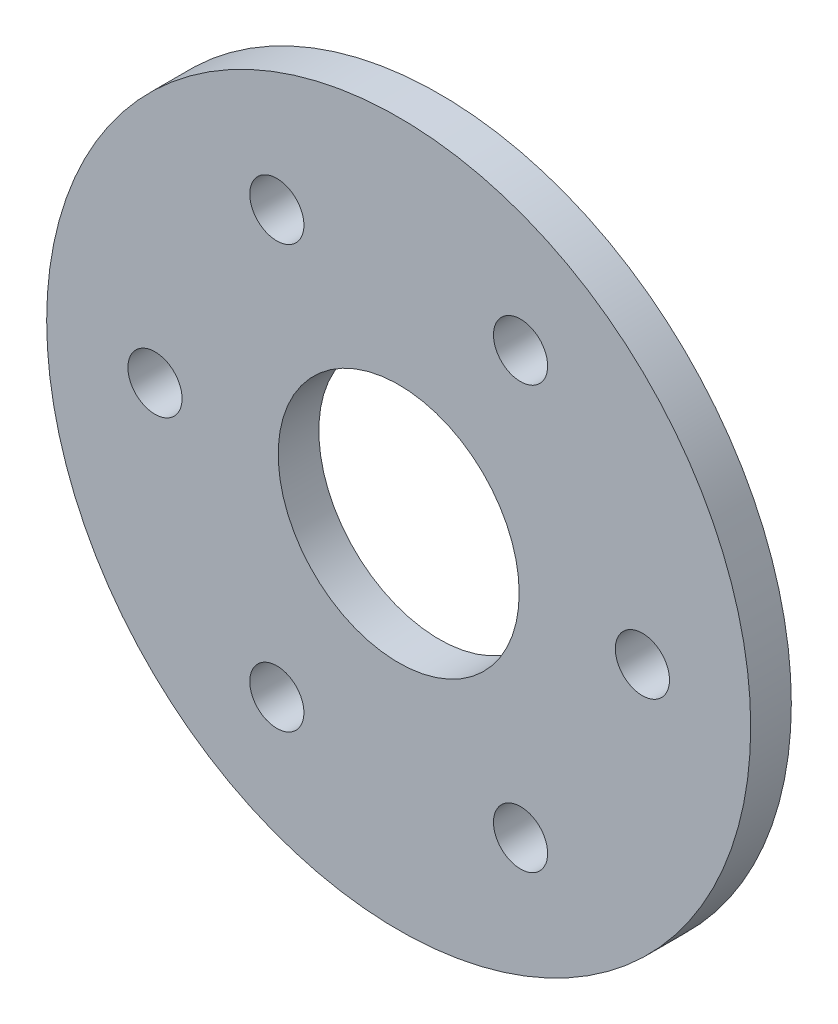
ISO-10303-21;
HEADER;
FILE_DESCRIPTION(('STEP AP214'),'2;1');
FILE_NAME('part.step','',(''),(''),'','','');
FILE_SCHEMA(('AUTOMOTIVE_DESIGN { 1 0 10303 214 1 1 1 1 }'));
ENDSEC;
DATA;
#1=APPLICATION_CONTEXT('core data for automotive mechanical design processes');
#2=APPLICATION_PROTOCOL_DEFINITION('international standard','automotive_design',2000,#1);
#3=PRODUCT_CONTEXT('',#1,'mechanical');
#4=PRODUCT('Part','Part','',(#3));
#5=PRODUCT_RELATED_PRODUCT_CATEGORY('part','',(#4));
#6=PRODUCT_DEFINITION_FORMATION('','',#4);
#7=PRODUCT_DEFINITION_CONTEXT('part definition',#1,'design');
#8=PRODUCT_DEFINITION('design','',#6,#7);
#9=PRODUCT_DEFINITION_SHAPE('','',#8);
#10=(LENGTH_UNIT() NAMED_UNIT(*) SI_UNIT(.MILLI.,.METRE.));
#11=(NAMED_UNIT(*) PLANE_ANGLE_UNIT() SI_UNIT($,.RADIAN.));
#12=(NAMED_UNIT(*) SI_UNIT($,.STERADIAN.) SOLID_ANGLE_UNIT());
#13=UNCERTAINTY_MEASURE_WITH_UNIT(LENGTH_MEASURE(1.E-05),#10,'distance_accuracy_value','');
#14=(GEOMETRIC_REPRESENTATION_CONTEXT(3) GLOBAL_UNCERTAINTY_ASSIGNED_CONTEXT((#13)) GLOBAL_UNIT_ASSIGNED_CONTEXT((#10,
#11,#12)) REPRESENTATION_CONTEXT('',''));
#15=CARTESIAN_POINT('',(0.,0.,0.));
#16=DIRECTION('',(0.,0.,1.));
#17=DIRECTION('',(1.,0.,0.));
#18=AXIS2_PLACEMENT_3D('',#15,#16,#17);
#19=CARTESIAN_POINT('',(-9.00000000000001,15.5884572681199,3.));
#20=DIRECTION('',(0.,0.,-1.));
#21=DIRECTION('',(-1.,0.,0.));
#22=AXIS2_PLACEMENT_3D('',#19,#20,#21);
#23=CYLINDRICAL_SURFACE('',#22,2.);
#24=CARTESIAN_POINT('',(-9.00000000000001,15.5884572681199,3.));
#25=DIRECTION('',(0.,0.,1.));
#26=DIRECTION('',(1.,0.,0.));
#27=AXIS2_PLACEMENT_3D('',#24,#25,#26);
#28=CIRCLE('',#27,2.);
#29=CARTESIAN_POINT('',(-7.00000000000001,15.5884572681199,3.));
#30=VERTEX_POINT('',#29);
#31=EDGE_CURVE('E48',#30,#30,#28,.T.);
#32=ORIENTED_EDGE('',*,*,#31,.T.);
#33=EDGE_LOOP('',(#32));
#34=FACE_BOUND('',#33,.T.);
#35=CARTESIAN_POINT('',(-9.00000000000001,15.5884572681199,0.));
#36=DIRECTION('',(0.,0.,1.));
#37=DIRECTION('',(1.,0.,0.));
#38=AXIS2_PLACEMENT_3D('',#35,#36,#37);
#39=CIRCLE('',#38,2.);
#40=CARTESIAN_POINT('',(-7.00000000000001,15.5884572681199,0.));
#41=VERTEX_POINT('',#40);
#42=EDGE_CURVE('E81',#41,#41,#39,.T.);
#43=ORIENTED_EDGE('',*,*,#42,.F.);
#44=EDGE_LOOP('',(#43));
#45=FACE_BOUND('',#44,.T.);
#46=ADVANCED_FACE('F39',(#34,#45),#23,.F.);
#47=CARTESIAN_POINT('',(8.99999999999999,15.5884572681199,3.));
#48=DIRECTION('',(0.,0.,-1.));
#49=DIRECTION('',(-1.,0.,0.));
#50=AXIS2_PLACEMENT_3D('',#47,#48,#49);
#51=CYLINDRICAL_SURFACE('',#50,2.);
#52=CARTESIAN_POINT('',(8.99999999999999,15.5884572681199,3.));
#53=DIRECTION('',(0.,0.,1.));
#54=DIRECTION('',(1.,0.,0.));
#55=AXIS2_PLACEMENT_3D('',#52,#53,#54);
#56=CIRCLE('',#55,2.);
#57=CARTESIAN_POINT('',(11.,15.5884572681199,3.));
#58=VERTEX_POINT('',#57);
#59=EDGE_CURVE('E54',#58,#58,#56,.T.);
#60=ORIENTED_EDGE('',*,*,#59,.T.);
#61=EDGE_LOOP('',(#60));
#62=FACE_BOUND('',#61,.T.);
#63=CARTESIAN_POINT('',(8.99999999999999,15.5884572681199,0.));
#64=DIRECTION('',(0.,0.,1.));
#65=DIRECTION('',(1.,0.,0.));
#66=AXIS2_PLACEMENT_3D('',#63,#64,#65);
#67=CIRCLE('',#66,2.);
#68=CARTESIAN_POINT('',(11.,15.5884572681199,0.));
#69=VERTEX_POINT('',#68);
#70=EDGE_CURVE('E78',#69,#69,#67,.T.);
#71=ORIENTED_EDGE('',*,*,#70,.F.);
#72=EDGE_LOOP('',(#71));
#73=FACE_BOUND('',#72,.T.);
#74=ADVANCED_FACE('F116',(#62,#73),#51,.F.);
#75=CARTESIAN_POINT('',(18.,0.,3.));
#76=DIRECTION('',(0.,0.,-1.));
#77=DIRECTION('',(-1.,0.,0.));
#78=AXIS2_PLACEMENT_3D('',#75,#76,#77);
#79=CYLINDRICAL_SURFACE('',#78,2.);
#80=CARTESIAN_POINT('',(18.,0.,3.));
#81=DIRECTION('',(0.,0.,1.));
#82=DIRECTION('',(1.,0.,0.));
#83=AXIS2_PLACEMENT_3D('',#80,#81,#82);
#84=CIRCLE('',#83,2.);
#85=CARTESIAN_POINT('',(20.,0.,3.));
#86=VERTEX_POINT('',#85);
#87=EDGE_CURVE('E109',#86,#86,#84,.T.);
#88=ORIENTED_EDGE('',*,*,#87,.T.);
#89=EDGE_LOOP('',(#88));
#90=FACE_BOUND('',#89,.T.);
#91=CARTESIAN_POINT('',(18.,0.,0.));
#92=DIRECTION('',(0.,0.,1.));
#93=DIRECTION('',(1.,0.,0.));
#94=AXIS2_PLACEMENT_3D('',#91,#92,#93);
#95=CIRCLE('',#94,2.);
#96=CARTESIAN_POINT('',(20.,0.,0.));
#97=VERTEX_POINT('',#96);
#98=EDGE_CURVE('E74',#97,#97,#95,.T.);
#99=ORIENTED_EDGE('',*,*,#98,.F.);
#100=EDGE_LOOP('',(#99));
#101=FACE_BOUND('',#100,.T.);
#102=ADVANCED_FACE('F134',(#90,#101),#79,.F.);
#103=CARTESIAN_POINT('',(9.00000000000001,-15.5884572681199,3.));
#104=DIRECTION('',(0.,0.,-1.));
#105=DIRECTION('',(-1.,0.,0.));
#106=AXIS2_PLACEMENT_3D('',#103,#104,#105);
#107=CYLINDRICAL_SURFACE('',#106,2.);
#108=CARTESIAN_POINT('',(9.00000000000001,-15.5884572681199,3.));
#109=DIRECTION('',(0.,0.,1.));
#110=DIRECTION('',(1.,0.,0.));
#111=AXIS2_PLACEMENT_3D('',#108,#109,#110);
#112=CIRCLE('',#111,2.);
#113=CARTESIAN_POINT('',(11.,-15.5884572681199,3.));
#114=VERTEX_POINT('',#113);
#115=EDGE_CURVE('E105',#114,#114,#112,.T.);
#116=ORIENTED_EDGE('',*,*,#115,.T.);
#117=EDGE_LOOP('',(#116));
#118=FACE_BOUND('',#117,.T.);
#119=CARTESIAN_POINT('',(9.00000000000001,-15.5884572681199,0.));
#120=DIRECTION('',(0.,0.,1.));
#121=DIRECTION('',(1.,0.,0.));
#122=AXIS2_PLACEMENT_3D('',#119,#120,#121);
#123=CIRCLE('',#122,2.);
#124=CARTESIAN_POINT('',(11.,-15.5884572681199,0.));
#125=VERTEX_POINT('',#124);
#126=EDGE_CURVE('E70',#125,#125,#123,.T.);
#127=ORIENTED_EDGE('',*,*,#126,.F.);
#128=EDGE_LOOP('',(#127));
#129=FACE_BOUND('',#128,.T.);
#130=ADVANCED_FACE('F141',(#118,#129),#107,.F.);
#131=CARTESIAN_POINT('',(-8.99999999999999,-15.5884572681199,3.));
#132=DIRECTION('',(0.,0.,-1.));
#133=DIRECTION('',(-1.,0.,0.));
#134=AXIS2_PLACEMENT_3D('',#131,#132,#133);
#135=CYLINDRICAL_SURFACE('',#134,2.);
#136=CARTESIAN_POINT('',(-8.99999999999999,-15.5884572681199,3.));
#137=DIRECTION('',(0.,0.,1.));
#138=DIRECTION('',(1.,0.,0.));
#139=AXIS2_PLACEMENT_3D('',#136,#137,#138);
#140=CIRCLE('',#139,2.);
#141=CARTESIAN_POINT('',(-6.99999999999999,-15.5884572681199,3.));
#142=VERTEX_POINT('',#141);
#143=EDGE_CURVE('E99',#142,#142,#140,.T.);
#144=ORIENTED_EDGE('',*,*,#143,.T.);
#145=EDGE_LOOP('',(#144));
#146=FACE_BOUND('',#145,.T.);
#147=CARTESIAN_POINT('',(-8.99999999999999,-15.5884572681199,0.));
#148=DIRECTION('',(0.,0.,1.));
#149=DIRECTION('',(1.,0.,0.));
#150=AXIS2_PLACEMENT_3D('',#147,#148,#149);
#151=CIRCLE('',#150,2.);
#152=CARTESIAN_POINT('',(-6.99999999999999,-15.5884572681199,0.));
#153=VERTEX_POINT('',#152);
#154=EDGE_CURVE('E66',#153,#153,#151,.T.);
#155=ORIENTED_EDGE('',*,*,#154,.F.);
#156=EDGE_LOOP('',(#155));
#157=FACE_BOUND('',#156,.T.);
#158=ADVANCED_FACE('F145',(#146,#157),#135,.F.);
#159=CARTESIAN_POINT('',(0.,0.,3.));
#160=DIRECTION('',(0.,0.,-1.));
#161=DIRECTION('',(-1.,0.,0.));
#162=AXIS2_PLACEMENT_3D('',#159,#160,#161);
#163=CYLINDRICAL_SURFACE('',#162,8.9);
#164=CARTESIAN_POINT('',(0.,0.,3.));
#165=DIRECTION('',(0.,0.,1.));
#166=DIRECTION('',(1.,0.,0.));
#167=AXIS2_PLACEMENT_3D('',#164,#165,#166);
#168=CIRCLE('',#167,8.9);
#169=CARTESIAN_POINT('',(8.9,0.,3.));
#170=VERTEX_POINT('',#169);
#171=EDGE_CURVE('E93',#170,#170,#168,.T.);
#172=ORIENTED_EDGE('',*,*,#171,.T.);
#173=EDGE_LOOP('',(#172));
#174=FACE_BOUND('',#173,.T.);
#175=CARTESIAN_POINT('',(0.,0.,0.));
#176=DIRECTION('',(0.,0.,1.));
#177=DIRECTION('',(1.,0.,0.));
#178=AXIS2_PLACEMENT_3D('',#175,#176,#177);
#179=CIRCLE('',#178,8.9);
#180=CARTESIAN_POINT('',(8.9,0.,0.));
#181=VERTEX_POINT('',#180);
#182=EDGE_CURVE('E62',#181,#181,#179,.T.);
#183=ORIENTED_EDGE('',*,*,#182,.F.);
#184=EDGE_LOOP('',(#183));
#185=FACE_BOUND('',#184,.T.);
#186=ADVANCED_FACE('F148',(#174,#185),#163,.F.);
#187=CARTESIAN_POINT('',(-18.,0.,3.));
#188=DIRECTION('',(0.,0.,-1.));
#189=DIRECTION('',(-1.,0.,0.));
#190=AXIS2_PLACEMENT_3D('',#187,#188,#189);
#191=CYLINDRICAL_SURFACE('',#190,2.);
#192=CARTESIAN_POINT('',(-18.,0.,3.));
#193=DIRECTION('',(0.,0.,1.));
#194=DIRECTION('',(1.,0.,0.));
#195=AXIS2_PLACEMENT_3D('',#192,#193,#194);
#196=CIRCLE('',#195,2.);
#197=CARTESIAN_POINT('',(-16.,0.,3.));
#198=VERTEX_POINT('',#197);
#199=EDGE_CURVE('E88',#198,#198,#196,.T.);
#200=ORIENTED_EDGE('',*,*,#199,.T.);
#201=EDGE_LOOP('',(#200));
#202=FACE_BOUND('',#201,.T.);
#203=CARTESIAN_POINT('',(-18.,0.,0.));
#204=DIRECTION('',(0.,0.,1.));
#205=DIRECTION('',(1.,0.,0.));
#206=AXIS2_PLACEMENT_3D('',#203,#204,#205);
#207=CIRCLE('',#206,2.);
#208=CARTESIAN_POINT('',(-16.,0.,0.));
#209=VERTEX_POINT('',#208);
#210=EDGE_CURVE('E58',#209,#209,#207,.T.);
#211=ORIENTED_EDGE('',*,*,#210,.F.);
#212=EDGE_LOOP('',(#211));
#213=FACE_BOUND('',#212,.T.);
#214=ADVANCED_FACE('F41',(#202,#213),#191,.F.);
#215=CARTESIAN_POINT('',(0.,0.,3.));
#216=DIRECTION('',(0.,0.,-1.));
#217=DIRECTION('',(-1.,0.,0.));
#218=AXIS2_PLACEMENT_3D('',#215,#216,#217);
#219=CYLINDRICAL_SURFACE('',#218,26.);
#220=CARTESIAN_POINT('',(0.,0.,3.));
#221=DIRECTION('',(0.,0.,1.));
#222=DIRECTION('',(1.,0.,0.));
#223=AXIS2_PLACEMENT_3D('',#220,#221,#222);
#224=CIRCLE('',#223,26.);
#225=CARTESIAN_POINT('',(26.,0.,3.));
#226=VERTEX_POINT('',#225);
#227=EDGE_CURVE('E10',#226,#226,#224,.T.);
#228=ORIENTED_EDGE('',*,*,#227,.F.);
#229=EDGE_LOOP('',(#228));
#230=FACE_BOUND('',#229,.T.);
#231=CARTESIAN_POINT('',(0.,0.,0.));
#232=DIRECTION('',(0.,0.,1.));
#233=DIRECTION('',(1.,0.,0.));
#234=AXIS2_PLACEMENT_3D('',#231,#232,#233);
#235=CIRCLE('',#234,26.);
#236=CARTESIAN_POINT('',(26.,0.,0.));
#237=VERTEX_POINT('',#236);
#238=EDGE_CURVE('E43',#237,#237,#235,.T.);
#239=ORIENTED_EDGE('',*,*,#238,.T.);
#240=EDGE_LOOP('',(#239));
#241=FACE_BOUND('',#240,.T.);
#242=ADVANCED_FACE('F123',(#230,#241),#219,.T.);
#243=CARTESIAN_POINT('',(0.,0.,3.));
#244=DIRECTION('',(0.,0.,1.));
#245=DIRECTION('',(1.,0.,0.));
#246=AXIS2_PLACEMENT_3D('',#243,#244,#245);
#247=PLANE('',#246);
#248=ORIENTED_EDGE('',*,*,#199,.F.);
#249=EDGE_LOOP('',(#248));
#250=FACE_BOUND('',#249,.T.);
#251=ORIENTED_EDGE('',*,*,#171,.F.);
#252=EDGE_LOOP('',(#251));
#253=FACE_BOUND('',#252,.T.);
#254=ORIENTED_EDGE('',*,*,#143,.F.);
#255=EDGE_LOOP('',(#254));
#256=FACE_BOUND('',#255,.T.);
#257=ORIENTED_EDGE('',*,*,#115,.F.);
#258=EDGE_LOOP('',(#257));
#259=FACE_BOUND('',#258,.T.);
#260=ORIENTED_EDGE('',*,*,#87,.F.);
#261=EDGE_LOOP('',(#260));
#262=FACE_BOUND('',#261,.T.);
#263=ORIENTED_EDGE('',*,*,#59,.F.);
#264=EDGE_LOOP('',(#263));
#265=FACE_BOUND('',#264,.T.);
#266=ORIENTED_EDGE('',*,*,#31,.F.);
#267=EDGE_LOOP('',(#266));
#268=FACE_BOUND('',#267,.T.);
#269=ORIENTED_EDGE('',*,*,#227,.T.);
#270=EDGE_LOOP('',(#269));
#271=FACE_BOUND('',#270,.T.);
#272=ADVANCED_FACE('F119',(#250,#253,#256,#259,#262,#265,#268,#271),#247,.T.);
#273=CARTESIAN_POINT('',(0.,0.,0.));
#274=DIRECTION('',(0.,0.,1.));
#275=DIRECTION('',(1.,0.,0.));
#276=AXIS2_PLACEMENT_3D('',#273,#274,#275);
#277=PLANE('',#276);
#278=ORIENTED_EDGE('',*,*,#210,.T.);
#279=EDGE_LOOP('',(#278));
#280=FACE_BOUND('',#279,.T.);
#281=ORIENTED_EDGE('',*,*,#182,.T.);
#282=EDGE_LOOP('',(#281));
#283=FACE_BOUND('',#282,.T.);
#284=ORIENTED_EDGE('',*,*,#154,.T.);
#285=EDGE_LOOP('',(#284));
#286=FACE_BOUND('',#285,.T.);
#287=ORIENTED_EDGE('',*,*,#126,.T.);
#288=EDGE_LOOP('',(#287));
#289=FACE_BOUND('',#288,.T.);
#290=ORIENTED_EDGE('',*,*,#98,.T.);
#291=EDGE_LOOP('',(#290));
#292=FACE_BOUND('',#291,.T.);
#293=ORIENTED_EDGE('',*,*,#70,.T.);
#294=EDGE_LOOP('',(#293));
#295=FACE_BOUND('',#294,.T.);
#296=ORIENTED_EDGE('',*,*,#42,.T.);
#297=EDGE_LOOP('',(#296));
#298=FACE_BOUND('',#297,.T.);
#299=ORIENTED_EDGE('',*,*,#238,.F.);
#300=EDGE_LOOP('',(#299));
#301=FACE_BOUND('',#300,.T.);
#302=ADVANCED_FACE('F122',(#280,#283,#286,#289,#292,#295,#298,#301),#277,.F.);
#303=CLOSED_SHELL('',(#46,#74,#102,#130,#158,#186,#214,#242,#272,#302));
#304=MANIFOLD_SOLID_BREP('B2',#303);
#305=ADVANCED_BREP_SHAPE_REPRESENTATION('',(#18,#304),#14);
#306=SHAPE_DEFINITION_REPRESENTATION(#9,#305);
ENDSEC;
END-ISO-10303-21;
